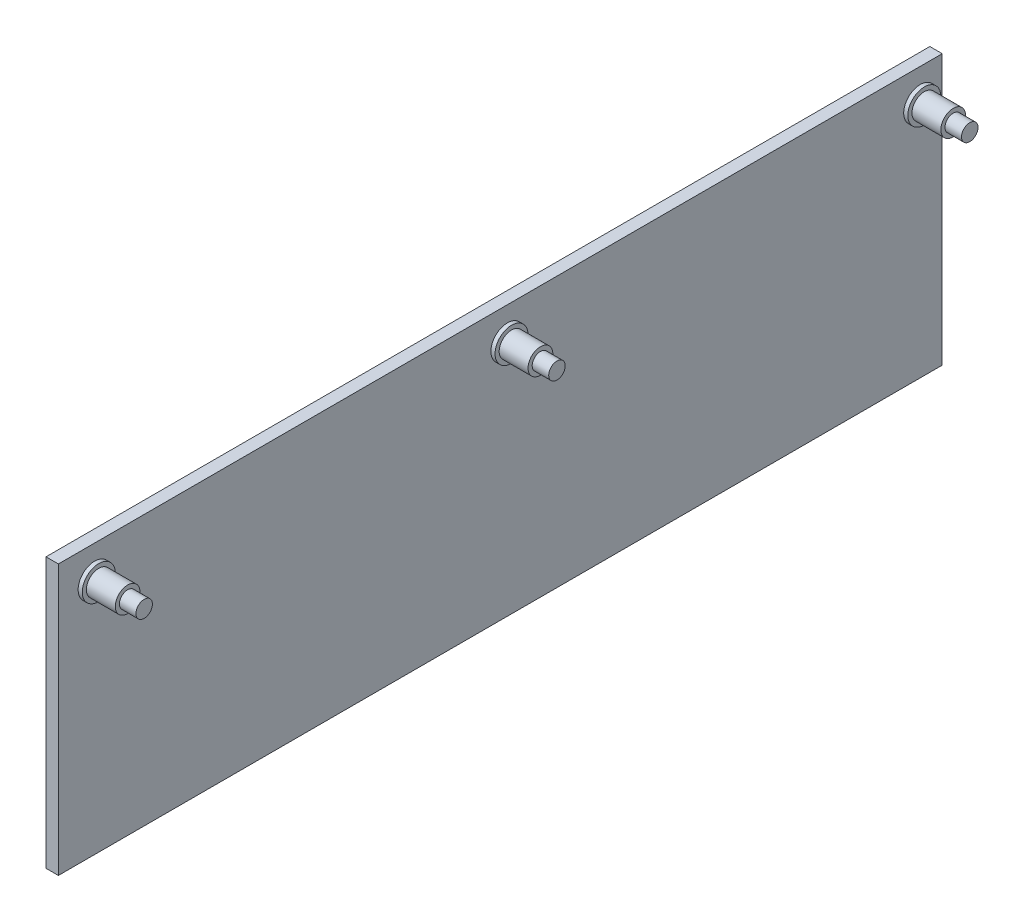
ISO-10303-21;
HEADER;
FILE_DESCRIPTION(('STEP AP214'),'2;1');
FILE_NAME('part.step','',(''),(''),'','','');
FILE_SCHEMA(('AUTOMOTIVE_DESIGN { 1 0 10303 214 1 1 1 1 }'));
ENDSEC;
DATA;
#1=APPLICATION_CONTEXT('core data for automotive mechanical design processes');
#2=APPLICATION_PROTOCOL_DEFINITION('international standard','automotive_design',2000,#1);
#3=PRODUCT_CONTEXT('',#1,'mechanical');
#4=PRODUCT('Part','Part','',(#3));
#5=PRODUCT_RELATED_PRODUCT_CATEGORY('part','',(#4));
#6=PRODUCT_DEFINITION_FORMATION('','',#4);
#7=PRODUCT_DEFINITION_CONTEXT('part definition',#1,'design');
#8=PRODUCT_DEFINITION('design','',#6,#7);
#9=PRODUCT_DEFINITION_SHAPE('','',#8);
#10=(LENGTH_UNIT() NAMED_UNIT(*) SI_UNIT(.MILLI.,.METRE.));
#11=(NAMED_UNIT(*) PLANE_ANGLE_UNIT() SI_UNIT($,.RADIAN.));
#12=(NAMED_UNIT(*) SI_UNIT($,.STERADIAN.) SOLID_ANGLE_UNIT());
#13=UNCERTAINTY_MEASURE_WITH_UNIT(LENGTH_MEASURE(1.E-05),#10,'distance_accuracy_value','');
#14=(GEOMETRIC_REPRESENTATION_CONTEXT(3) GLOBAL_UNCERTAINTY_ASSIGNED_CONTEXT((#13)) GLOBAL_UNIT_ASSIGNED_CONTEXT((#10,
#11,#12)) REPRESENTATION_CONTEXT('',''));
#15=CARTESIAN_POINT('',(0.,0.,0.));
#16=DIRECTION('',(0.,0.,1.));
#17=DIRECTION('',(1.,0.,0.));
#18=AXIS2_PLACEMENT_3D('',#15,#16,#17);
#19=CARTESIAN_POINT('',(11.,57.5544844238051,5.3347671097598));
#20=DIRECTION('',(-1.,0.,0.));
#21=DIRECTION('',(0.,0.,1.));
#22=AXIS2_PLACEMENT_3D('',#19,#20,#21);
#23=CYLINDRICAL_SURFACE('',#22,3.);
#24=CARTESIAN_POINT('',(4.,57.5544844238051,5.3347671097598));
#25=DIRECTION('',(1.,0.,0.));
#26=DIRECTION('',(0.,0.,-1.));
#27=AXIS2_PLACEMENT_3D('',#24,#25,#26);
#28=CIRCLE('',#27,3.);
#29=CARTESIAN_POINT('',(4.,57.5544844238051,2.3347671097598));
#30=VERTEX_POINT('',#29);
#31=EDGE_CURVE('E122',#30,#30,#28,.T.);
#32=ORIENTED_EDGE('',*,*,#31,.T.);
#33=EDGE_LOOP('',(#32));
#34=FACE_BOUND('',#33,.T.);
#35=CARTESIAN_POINT('',(11.,57.5544844238051,5.3347671097598));
#36=DIRECTION('',(1.,0.,0.));
#37=DIRECTION('',(0.,0.,-1.));
#38=AXIS2_PLACEMENT_3D('',#35,#36,#37);
#39=CIRCLE('',#38,3.);
#40=CARTESIAN_POINT('',(11.,57.5544844238051,2.3347671097598));
#41=VERTEX_POINT('',#40);
#42=EDGE_CURVE('E121',#41,#41,#39,.T.);
#43=ORIENTED_EDGE('',*,*,#42,.F.);
#44=EDGE_LOOP('',(#43));
#45=FACE_BOUND('',#44,.T.);
#46=ADVANCED_FACE('F41',(#34,#45),#23,.T.);
#47=CARTESIAN_POINT('',(11.,57.5544844238051,5.3347671097598));
#48=DIRECTION('',(1.,0.,0.));
#49=DIRECTION('',(0.,0.,-1.));
#50=AXIS2_PLACEMENT_3D('',#47,#48,#49);
#51=PLANE('',#50);
#52=CARTESIAN_POINT('',(11.,57.5544844238051,5.3347671097598));
#53=DIRECTION('',(1.,0.,0.));
#54=DIRECTION('',(0.,0.,-1.));
#55=AXIS2_PLACEMENT_3D('',#52,#53,#54);
#56=CIRCLE('',#55,2.);
#57=CARTESIAN_POINT('',(11.,57.5544844238051,3.3347671097598));
#58=VERTEX_POINT('',#57);
#59=EDGE_CURVE('E117',#58,#58,#56,.T.);
#60=ORIENTED_EDGE('',*,*,#59,.F.);
#61=EDGE_LOOP('',(#60));
#62=FACE_BOUND('',#61,.T.);
#63=ORIENTED_EDGE('',*,*,#42,.T.);
#64=EDGE_LOOP('',(#63));
#65=FACE_BOUND('',#64,.T.);
#66=ADVANCED_FACE('F184',(#62,#65),#51,.T.);
#67=CARTESIAN_POINT('',(15.,57.5544844238051,5.3347671097598));
#68=DIRECTION('',(1.,0.,0.));
#69=DIRECTION('',(0.,0.,-1.));
#70=AXIS2_PLACEMENT_3D('',#67,#68,#69);
#71=PLANE('',#70);
#72=CARTESIAN_POINT('',(15.,57.5544844238051,5.3347671097598));
#73=DIRECTION('',(1.,0.,0.));
#74=DIRECTION('',(0.,0.,-1.));
#75=AXIS2_PLACEMENT_3D('',#72,#73,#74);
#76=CIRCLE('',#75,2.);
#77=CARTESIAN_POINT('',(15.,57.5544844238051,3.3347671097598));
#78=VERTEX_POINT('',#77);
#79=EDGE_CURVE('E111',#78,#78,#76,.T.);
#80=ORIENTED_EDGE('',*,*,#79,.T.);
#81=EDGE_LOOP('',(#80));
#82=FACE_BOUND('',#81,.T.);
#83=ADVANCED_FACE('F168',(#82),#71,.T.);
#84=CARTESIAN_POINT('',(15.,57.5544844238051,5.3347671097598));
#85=DIRECTION('',(-1.,0.,0.));
#86=DIRECTION('',(0.,0.,1.));
#87=AXIS2_PLACEMENT_3D('',#84,#85,#86);
#88=CYLINDRICAL_SURFACE('',#87,2.);
#89=ORIENTED_EDGE('',*,*,#59,.T.);
#90=EDGE_LOOP('',(#89));
#91=FACE_BOUND('',#90,.T.);
#92=ORIENTED_EDGE('',*,*,#79,.F.);
#93=EDGE_LOOP('',(#92));
#94=FACE_BOUND('',#93,.T.);
#95=ADVANCED_FACE('F170',(#91,#94),#88,.T.);
#96=CARTESIAN_POINT('',(4.,57.5544844238051,5.3347671097598));
#97=DIRECTION('',(-1.,0.,0.));
#98=DIRECTION('',(0.,0.,1.));
#99=AXIS2_PLACEMENT_3D('',#96,#97,#98);
#100=CYLINDRICAL_SURFACE('',#99,4.);
#101=CARTESIAN_POINT('',(4.,57.5544844238051,5.3347671097598));
#102=DIRECTION('',(1.,0.,0.));
#103=DIRECTION('',(0.,0.,-1.));
#104=AXIS2_PLACEMENT_3D('',#101,#102,#103);
#105=CIRCLE('',#104,4.);
#106=CARTESIAN_POINT('',(4.,57.5544844238051,1.3347671097598));
#107=VERTEX_POINT('',#106);
#108=EDGE_CURVE('E125',#107,#107,#105,.T.);
#109=ORIENTED_EDGE('',*,*,#108,.F.);
#110=EDGE_LOOP('',(#109));
#111=FACE_BOUND('',#110,.T.);
#112=CARTESIAN_POINT('',(3.,57.5544844238051,5.3347671097598));
#113=DIRECTION('',(1.,0.,0.));
#114=DIRECTION('',(0.,0.,-1.));
#115=AXIS2_PLACEMENT_3D('',#112,#113,#114);
#116=CIRCLE('',#115,4.);
#117=CARTESIAN_POINT('',(3.,57.5544844238051,1.3347671097598));
#118=VERTEX_POINT('',#117);
#119=EDGE_CURVE('E129',#118,#118,#116,.T.);
#120=ORIENTED_EDGE('',*,*,#119,.T.);
#121=EDGE_LOOP('',(#120));
#122=FACE_BOUND('',#121,.T.);
#123=ADVANCED_FACE('F172',(#111,#122),#100,.T.);
#124=CARTESIAN_POINT('',(4.,57.5544844238051,5.3347671097598));
#125=DIRECTION('',(1.,0.,0.));
#126=DIRECTION('',(0.,0.,-1.));
#127=AXIS2_PLACEMENT_3D('',#124,#125,#126);
#128=PLANE('',#127);
#129=ORIENTED_EDGE('',*,*,#31,.F.);
#130=EDGE_LOOP('',(#129));
#131=FACE_BOUND('',#130,.T.);
#132=ORIENTED_EDGE('',*,*,#108,.T.);
#133=EDGE_LOOP('',(#132));
#134=FACE_BOUND('',#133,.T.);
#135=ADVANCED_FACE('F180',(#131,#134),#128,.T.);
#136=CARTESIAN_POINT('',(0.,0.,0.));
#137=DIRECTION('',(1.,0.,0.));
#138=DIRECTION('',(0.,0.,-1.));
#139=AXIS2_PLACEMENT_3D('',#136,#137,#138);
#140=PLANE('',#139);
#141=DIRECTION('',(0.,0.,-1.));
#142=VECTOR('',#141,1.);
#143=CARTESIAN_POINT('',(0.,0.,214.117990109261));
#144=LINE('',#143,#142);
#145=CARTESIAN_POINT('',(0.,0.,214.117990109261));
#146=VERTEX_POINT('',#145);
#147=CARTESIAN_POINT('',(0.,0.,0.));
#148=VERTEX_POINT('',#147);
#149=EDGE_CURVE('E108',#146,#148,#144,.T.);
#150=ORIENTED_EDGE('',*,*,#149,.F.);
#151=DIRECTION('',(0.,-1.,0.));
#152=VECTOR('',#151,1.);
#153=CARTESIAN_POINT('',(0.,65.3592410456608,214.117990109261));
#154=LINE('',#153,#152);
#155=CARTESIAN_POINT('',(0.,65.3592410456608,214.117990109261));
#156=VERTEX_POINT('',#155);
#157=EDGE_CURVE('E83',#156,#146,#154,.T.);
#158=ORIENTED_EDGE('',*,*,#157,.F.);
#159=DIRECTION('',(0.,0.,1.));
#160=VECTOR('',#159,1.);
#161=CARTESIAN_POINT('',(0.,65.3592410456608,0.));
#162=LINE('',#161,#160);
#163=CARTESIAN_POINT('',(0.,65.3592410456608,0.));
#164=VERTEX_POINT('',#163);
#165=EDGE_CURVE('E77',#164,#156,#162,.T.);
#166=ORIENTED_EDGE('',*,*,#165,.F.);
#167=DIRECTION('',(0.,1.,0.));
#168=VECTOR('',#167,1.);
#169=CARTESIAN_POINT('',(0.,0.,0.));
#170=LINE('',#169,#168);
#171=EDGE_CURVE('E99',#148,#164,#170,.T.);
#172=ORIENTED_EDGE('',*,*,#171,.F.);
#173=EDGE_LOOP('',(#150,#158,#166,#172));
#174=FACE_BOUND('',#173,.T.);
#175=ADVANCED_FACE('F240',(#174),#140,.F.);
#176=CARTESIAN_POINT('',(3.,65.3592410456608,214.117990109261));
#177=DIRECTION('',(0.,0.,-1.));
#178=DIRECTION('',(-1.,0.,0.));
#179=AXIS2_PLACEMENT_3D('',#176,#177,#178);
#180=PLANE('',#179);
#181=ORIENTED_EDGE('',*,*,#157,.T.);
#182=DIRECTION('',(-1.,0.,0.));
#183=VECTOR('',#182,1.);
#184=CARTESIAN_POINT('',(3.,0.,214.117990109261));
#185=LINE('',#184,#183);
#186=CARTESIAN_POINT('',(3.,0.,214.117990109261));
#187=VERTEX_POINT('',#186);
#188=EDGE_CURVE('E104',#187,#146,#185,.T.);
#189=ORIENTED_EDGE('',*,*,#188,.F.);
#190=DIRECTION('',(0.,-1.,0.));
#191=VECTOR('',#190,1.);
#192=CARTESIAN_POINT('',(3.,65.3592410456608,214.117990109261));
#193=LINE('',#192,#191);
#194=CARTESIAN_POINT('',(3.,65.3592410456608,214.117990109261));
#195=VERTEX_POINT('',#194);
#196=EDGE_CURVE('E60',#195,#187,#193,.T.);
#197=ORIENTED_EDGE('',*,*,#196,.F.);
#198=DIRECTION('',(-1.,0.,0.));
#199=VECTOR('',#198,1.);
#200=CARTESIAN_POINT('',(3.,65.3592410456608,214.117990109261));
#201=LINE('',#200,#199);
#202=EDGE_CURVE('E100',#195,#156,#201,.T.);
#203=ORIENTED_EDGE('',*,*,#202,.T.);
#204=EDGE_LOOP('',(#181,#189,#197,#203));
#205=FACE_BOUND('',#204,.T.);
#206=ADVANCED_FACE('F245',(#205),#180,.F.);
#207=CARTESIAN_POINT('',(3.,65.3592410456608,0.));
#208=DIRECTION('',(0.,-1.,0.));
#209=DIRECTION('',(0.,0.,-1.));
#210=AXIS2_PLACEMENT_3D('',#207,#208,#209);
#211=PLANE('',#210);
#212=ORIENTED_EDGE('',*,*,#165,.T.);
#213=ORIENTED_EDGE('',*,*,#202,.F.);
#214=DIRECTION('',(0.,0.,1.));
#215=VECTOR('',#214,1.);
#216=CARTESIAN_POINT('',(3.,65.3592410456608,0.));
#217=LINE('',#216,#215);
#218=CARTESIAN_POINT('',(3.,65.3592410456608,0.));
#219=VERTEX_POINT('',#218);
#220=EDGE_CURVE('E93',#219,#195,#217,.T.);
#221=ORIENTED_EDGE('',*,*,#220,.F.);
#222=DIRECTION('',(-1.,0.,0.));
#223=VECTOR('',#222,1.);
#224=CARTESIAN_POINT('',(3.,65.3592410456608,0.));
#225=LINE('',#224,#223);
#226=EDGE_CURVE('E51',#219,#164,#225,.T.);
#227=ORIENTED_EDGE('',*,*,#226,.T.);
#228=EDGE_LOOP('',(#212,#213,#221,#227));
#229=FACE_BOUND('',#228,.T.);
#230=ADVANCED_FACE('F102',(#229),#211,.F.);
#231=CARTESIAN_POINT('',(3.,0.,0.));
#232=DIRECTION('',(0.,0.,1.));
#233=DIRECTION('',(1.,0.,0.));
#234=AXIS2_PLACEMENT_3D('',#231,#232,#233);
#235=PLANE('',#234);
#236=ORIENTED_EDGE('',*,*,#171,.T.);
#237=ORIENTED_EDGE('',*,*,#226,.F.);
#238=DIRECTION('',(0.,1.,0.));
#239=VECTOR('',#238,1.);
#240=CARTESIAN_POINT('',(3.,0.,0.));
#241=LINE('',#240,#239);
#242=CARTESIAN_POINT('',(3.,0.,0.));
#243=VERTEX_POINT('',#242);
#244=EDGE_CURVE('E90',#243,#219,#241,.T.);
#245=ORIENTED_EDGE('',*,*,#244,.F.);
#246=DIRECTION('',(-1.,0.,0.));
#247=VECTOR('',#246,1.);
#248=CARTESIAN_POINT('',(3.,0.,0.));
#249=LINE('',#248,#247);
#250=EDGE_CURVE('E11',#243,#148,#249,.T.);
#251=ORIENTED_EDGE('',*,*,#250,.T.);
#252=EDGE_LOOP('',(#236,#237,#245,#251));
#253=FACE_BOUND('',#252,.T.);
#254=ADVANCED_FACE('F98',(#253),#235,.F.);
#255=CARTESIAN_POINT('',(3.,0.,214.117990109261));
#256=DIRECTION('',(0.,1.,0.));
#257=DIRECTION('',(0.,0.,1.));
#258=AXIS2_PLACEMENT_3D('',#255,#256,#257);
#259=PLANE('',#258);
#260=ORIENTED_EDGE('',*,*,#149,.T.);
#261=ORIENTED_EDGE('',*,*,#250,.F.);
#262=DIRECTION('',(0.,0.,-1.));
#263=VECTOR('',#262,1.);
#264=CARTESIAN_POINT('',(3.,0.,214.117990109261));
#265=LINE('',#264,#263);
#266=EDGE_CURVE('E95',#187,#243,#265,.T.);
#267=ORIENTED_EDGE('',*,*,#266,.F.);
#268=ORIENTED_EDGE('',*,*,#188,.T.);
#269=EDGE_LOOP('',(#260,#261,#267,#268));
#270=FACE_BOUND('',#269,.T.);
#271=ADVANCED_FACE('F43',(#270),#259,.F.);
#272=CARTESIAN_POINT('',(3.,0.,0.));
#273=DIRECTION('',(1.,0.,0.));
#274=DIRECTION('',(0.,0.,-1.));
#275=AXIS2_PLACEMENT_3D('',#272,#273,#274);
#276=PLANE('',#275);
#277=CARTESIAN_POINT('',(3.,57.5544844238053,205.334767109757));
#278=DIRECTION('',(1.,0.,0.));
#279=DIRECTION('',(0.,0.,-1.));
#280=AXIS2_PLACEMENT_3D('',#277,#278,#279);
#281=CIRCLE('',#280,3.99999999999999);
#282=CARTESIAN_POINT('',(3.,57.5544844238053,201.334767109757));
#283=VERTEX_POINT('',#282);
#284=EDGE_CURVE('E149',#283,#283,#281,.T.);
#285=ORIENTED_EDGE('',*,*,#284,.F.);
#286=EDGE_LOOP('',(#285));
#287=FACE_BOUND('',#286,.T.);
#288=CARTESIAN_POINT('',(3.,57.554484423805,105.33476710976));
#289=DIRECTION('',(1.,0.,0.));
#290=DIRECTION('',(0.,0.,-1.));
#291=AXIS2_PLACEMENT_3D('',#288,#289,#290);
#292=CIRCLE('',#291,4.00000000000281);
#293=CARTESIAN_POINT('',(3.,57.554484423805,101.334767109757));
#294=VERTEX_POINT('',#293);
#295=EDGE_CURVE('E142',#294,#294,#292,.T.);
#296=ORIENTED_EDGE('',*,*,#295,.F.);
#297=EDGE_LOOP('',(#296));
#298=FACE_BOUND('',#297,.T.);
#299=ORIENTED_EDGE('',*,*,#119,.F.);
#300=EDGE_LOOP('',(#299));
#301=FACE_BOUND('',#300,.T.);
#302=ORIENTED_EDGE('',*,*,#266,.T.);
#303=ORIENTED_EDGE('',*,*,#244,.T.);
#304=ORIENTED_EDGE('',*,*,#220,.T.);
#305=ORIENTED_EDGE('',*,*,#196,.T.);
#306=EDGE_LOOP('',(#302,#303,#304,#305));
#307=FACE_BOUND('',#306,.T.);
#308=ADVANCED_FACE('F91',(#287,#298,#301,#307),#276,.T.);
#309=CARTESIAN_POINT('',(4.,57.554484423805,105.33476710976));
#310=DIRECTION('',(-1.,0.,0.));
#311=DIRECTION('',(0.,0.,1.));
#312=AXIS2_PLACEMENT_3D('',#309,#310,#311);
#313=CYLINDRICAL_SURFACE('',#312,4.00000000000281);
#314=CARTESIAN_POINT('',(4.,57.554484423805,105.33476710976));
#315=DIRECTION('',(1.,0.,0.));
#316=DIRECTION('',(0.,0.,-1.));
#317=AXIS2_PLACEMENT_3D('',#314,#315,#316);
#318=CIRCLE('',#317,4.00000000000281);
#319=CARTESIAN_POINT('',(4.,57.554484423805,101.334767109757));
#320=VERTEX_POINT('',#319);
#321=EDGE_CURVE('E136',#320,#320,#318,.T.);
#322=ORIENTED_EDGE('',*,*,#321,.F.);
#323=EDGE_LOOP('',(#322));
#324=FACE_BOUND('',#323,.T.);
#325=ORIENTED_EDGE('',*,*,#295,.T.);
#326=EDGE_LOOP('',(#325));
#327=FACE_BOUND('',#326,.T.);
#328=ADVANCED_FACE('F254',(#324,#327),#313,.T.);
#329=CARTESIAN_POINT('',(4.,57.554484423805,105.33476710976));
#330=DIRECTION('',(1.,0.,0.));
#331=DIRECTION('',(0.,0.,-1.));
#332=AXIS2_PLACEMENT_3D('',#329,#330,#331);
#333=PLANE('',#332);
#334=CARTESIAN_POINT('',(4.,57.554484423805,105.33476710976));
#335=DIRECTION('',(1.,0.,0.));
#336=DIRECTION('',(0.,0.,-1.));
#337=AXIS2_PLACEMENT_3D('',#334,#335,#336);
#338=CIRCLE('',#337,3.00000000000282);
#339=CARTESIAN_POINT('',(4.,57.554484423805,102.334767109757));
#340=VERTEX_POINT('',#339);
#341=EDGE_CURVE('E134',#340,#340,#338,.T.);
#342=ORIENTED_EDGE('',*,*,#341,.F.);
#343=EDGE_LOOP('',(#342));
#344=FACE_BOUND('',#343,.T.);
#345=ORIENTED_EDGE('',*,*,#321,.T.);
#346=EDGE_LOOP('',(#345));
#347=FACE_BOUND('',#346,.T.);
#348=ADVANCED_FACE('F209',(#344,#347),#333,.T.);
#349=CARTESIAN_POINT('',(15.,57.554484423805,105.33476710976));
#350=DIRECTION('',(1.,0.,0.));
#351=DIRECTION('',(0.,0.,-1.));
#352=AXIS2_PLACEMENT_3D('',#349,#350,#351);
#353=PLANE('',#352);
#354=CARTESIAN_POINT('',(15.,57.554484423805,105.33476710976));
#355=DIRECTION('',(1.,0.,0.));
#356=DIRECTION('',(0.,0.,-1.));
#357=AXIS2_PLACEMENT_3D('',#354,#355,#356);
#358=CIRCLE('',#357,2.0000000000028);
#359=CARTESIAN_POINT('',(15.,57.554484423805,103.334767109757));
#360=VERTEX_POINT('',#359);
#361=EDGE_CURVE('E162',#360,#360,#358,.T.);
#362=ORIENTED_EDGE('',*,*,#361,.T.);
#363=EDGE_LOOP('',(#362));
#364=FACE_BOUND('',#363,.T.);
#365=ADVANCED_FACE('F205',(#364),#353,.T.);
#366=CARTESIAN_POINT('',(15.,57.554484423805,105.33476710976));
#367=DIRECTION('',(-1.,0.,0.));
#368=DIRECTION('',(0.,0.,1.));
#369=AXIS2_PLACEMENT_3D('',#366,#367,#368);
#370=CYLINDRICAL_SURFACE('',#369,2.0000000000028);
#371=CARTESIAN_POINT('',(11.,57.554484423805,105.33476710976));
#372=DIRECTION('',(1.,0.,0.));
#373=DIRECTION('',(0.,0.,-1.));
#374=AXIS2_PLACEMENT_3D('',#371,#372,#373);
#375=CIRCLE('',#374,2.0000000000028);
#376=CARTESIAN_POINT('',(11.,57.554484423805,103.334767109757));
#377=VERTEX_POINT('',#376);
#378=EDGE_CURVE('E126',#377,#377,#375,.T.);
#379=ORIENTED_EDGE('',*,*,#378,.T.);
#380=EDGE_LOOP('',(#379));
#381=FACE_BOUND('',#380,.T.);
#382=ORIENTED_EDGE('',*,*,#361,.F.);
#383=EDGE_LOOP('',(#382));
#384=FACE_BOUND('',#383,.T.);
#385=ADVANCED_FACE('F208',(#381,#384),#370,.T.);
#386=CARTESIAN_POINT('',(11.,57.554484423805,105.33476710976));
#387=DIRECTION('',(1.,0.,0.));
#388=DIRECTION('',(0.,0.,-1.));
#389=AXIS2_PLACEMENT_3D('',#386,#387,#388);
#390=PLANE('',#389);
#391=ORIENTED_EDGE('',*,*,#378,.F.);
#392=EDGE_LOOP('',(#391));
#393=FACE_BOUND('',#392,.T.);
#394=CARTESIAN_POINT('',(11.,57.554484423805,105.33476710976));
#395=DIRECTION('',(1.,0.,0.));
#396=DIRECTION('',(0.,0.,-1.));
#397=AXIS2_PLACEMENT_3D('',#394,#395,#396);
#398=CIRCLE('',#397,3.00000000000282);
#399=CARTESIAN_POINT('',(11.,57.554484423805,102.334767109757));
#400=VERTEX_POINT('',#399);
#401=EDGE_CURVE('E130',#400,#400,#398,.T.);
#402=ORIENTED_EDGE('',*,*,#401,.T.);
#403=EDGE_LOOP('',(#402));
#404=FACE_BOUND('',#403,.T.);
#405=ADVANCED_FACE('F212',(#393,#404),#390,.T.);
#406=CARTESIAN_POINT('',(11.,57.554484423805,105.33476710976));
#407=DIRECTION('',(-1.,0.,0.));
#408=DIRECTION('',(0.,0.,1.));
#409=AXIS2_PLACEMENT_3D('',#406,#407,#408);
#410=CYLINDRICAL_SURFACE('',#409,3.00000000000282);
#411=ORIENTED_EDGE('',*,*,#341,.T.);
#412=EDGE_LOOP('',(#411));
#413=FACE_BOUND('',#412,.T.);
#414=ORIENTED_EDGE('',*,*,#401,.F.);
#415=EDGE_LOOP('',(#414));
#416=FACE_BOUND('',#415,.T.);
#417=ADVANCED_FACE('F218',(#413,#416),#410,.T.);
#418=CARTESIAN_POINT('',(4.,57.5544844238053,205.334767109757));
#419=DIRECTION('',(-1.,0.,0.));
#420=DIRECTION('',(0.,0.,1.));
#421=AXIS2_PLACEMENT_3D('',#418,#419,#420);
#422=CYLINDRICAL_SURFACE('',#421,3.99999999999999);
#423=CARTESIAN_POINT('',(4.,57.5544844238053,205.334767109757));
#424=DIRECTION('',(1.,0.,0.));
#425=DIRECTION('',(0.,0.,-1.));
#426=AXIS2_PLACEMENT_3D('',#423,#424,#425);
#427=CIRCLE('',#426,3.99999999999999);
#428=CARTESIAN_POINT('',(4.,57.5544844238053,201.334767109757));
#429=VERTEX_POINT('',#428);
#430=EDGE_CURVE('E388',#429,#429,#427,.T.);
#431=ORIENTED_EDGE('',*,*,#430,.F.);
#432=EDGE_LOOP('',(#431));
#433=FACE_BOUND('',#432,.T.);
#434=ORIENTED_EDGE('',*,*,#284,.T.);
#435=EDGE_LOOP('',(#434));
#436=FACE_BOUND('',#435,.T.);
#437=ADVANCED_FACE('F228',(#433,#436),#422,.T.);
#438=CARTESIAN_POINT('',(4.,57.5544844238053,205.334767109757));
#439=DIRECTION('',(1.,0.,0.));
#440=DIRECTION('',(0.,0.,-1.));
#441=AXIS2_PLACEMENT_3D('',#438,#439,#440);
#442=PLANE('',#441);
#443=CARTESIAN_POINT('',(4.,57.5544844238053,205.334767109757));
#444=DIRECTION('',(1.,0.,0.));
#445=DIRECTION('',(0.,0.,-1.));
#446=AXIS2_PLACEMENT_3D('',#443,#444,#445);
#447=CIRCLE('',#446,2.99999999999999);
#448=CARTESIAN_POINT('',(4.,57.5544844238053,202.334767109757));
#449=VERTEX_POINT('',#448);
#450=EDGE_CURVE('E45',#449,#449,#447,.T.);
#451=ORIENTED_EDGE('',*,*,#450,.F.);
#452=EDGE_LOOP('',(#451));
#453=FACE_BOUND('',#452,.T.);
#454=ORIENTED_EDGE('',*,*,#430,.T.);
#455=EDGE_LOOP('',(#454));
#456=FACE_BOUND('',#455,.T.);
#457=ADVANCED_FACE('F199',(#453,#456),#442,.T.);
#458=CARTESIAN_POINT('',(15.,57.5544844238053,205.334767109757));
#459=DIRECTION('',(1.,0.,0.));
#460=DIRECTION('',(0.,0.,-1.));
#461=AXIS2_PLACEMENT_3D('',#458,#459,#460);
#462=PLANE('',#461);
#463=CARTESIAN_POINT('',(15.,57.5544844238053,205.334767109757));
#464=DIRECTION('',(1.,0.,0.));
#465=DIRECTION('',(0.,0.,-1.));
#466=AXIS2_PLACEMENT_3D('',#463,#464,#465);
#467=CIRCLE('',#466,2.);
#468=CARTESIAN_POINT('',(15.,57.5544844238053,203.334767109757));
#469=VERTEX_POINT('',#468);
#470=EDGE_CURVE('E120',#469,#469,#467,.T.);
#471=ORIENTED_EDGE('',*,*,#470,.T.);
#472=EDGE_LOOP('',(#471));
#473=FACE_BOUND('',#472,.T.);
#474=ADVANCED_FACE('F195',(#473),#462,.T.);
#475=CARTESIAN_POINT('',(15.,57.5544844238053,205.334767109757));
#476=DIRECTION('',(-1.,0.,0.));
#477=DIRECTION('',(0.,0.,1.));
#478=AXIS2_PLACEMENT_3D('',#475,#476,#477);
#479=CYLINDRICAL_SURFACE('',#478,2.);
#480=CARTESIAN_POINT('',(11.,57.5544844238053,205.334767109757));
#481=DIRECTION('',(1.,0.,0.));
#482=DIRECTION('',(0.,0.,-1.));
#483=AXIS2_PLACEMENT_3D('',#480,#481,#482);
#484=CIRCLE('',#483,2.);
#485=CARTESIAN_POINT('',(11.,57.5544844238053,203.334767109757));
#486=VERTEX_POINT('',#485);
#487=EDGE_CURVE('E131',#486,#486,#484,.T.);
#488=ORIENTED_EDGE('',*,*,#487,.T.);
#489=EDGE_LOOP('',(#488));
#490=FACE_BOUND('',#489,.T.);
#491=ORIENTED_EDGE('',*,*,#470,.F.);
#492=EDGE_LOOP('',(#491));
#493=FACE_BOUND('',#492,.T.);
#494=ADVANCED_FACE('F198',(#490,#493),#479,.T.);
#495=CARTESIAN_POINT('',(11.,57.5544844238053,205.334767109757));
#496=DIRECTION('',(1.,0.,0.));
#497=DIRECTION('',(0.,0.,-1.));
#498=AXIS2_PLACEMENT_3D('',#495,#496,#497);
#499=PLANE('',#498);
#500=ORIENTED_EDGE('',*,*,#487,.F.);
#501=EDGE_LOOP('',(#500));
#502=FACE_BOUND('',#501,.T.);
#503=CARTESIAN_POINT('',(11.,57.5544844238053,205.334767109757));
#504=DIRECTION('',(1.,0.,0.));
#505=DIRECTION('',(0.,0.,-1.));
#506=AXIS2_PLACEMENT_3D('',#503,#504,#505);
#507=CIRCLE('',#506,2.99999999999999);
#508=CARTESIAN_POINT('',(11.,57.5544844238053,202.334767109757));
#509=VERTEX_POINT('',#508);
#510=EDGE_CURVE('E133',#509,#509,#507,.T.);
#511=ORIENTED_EDGE('',*,*,#510,.T.);
#512=EDGE_LOOP('',(#511));
#513=FACE_BOUND('',#512,.T.);
#514=ADVANCED_FACE('F203',(#502,#513),#499,.T.);
#515=CARTESIAN_POINT('',(11.,57.5544844238053,205.334767109757));
#516=DIRECTION('',(-1.,0.,0.));
#517=DIRECTION('',(0.,0.,1.));
#518=AXIS2_PLACEMENT_3D('',#515,#516,#517);
#519=CYLINDRICAL_SURFACE('',#518,2.99999999999999);
#520=ORIENTED_EDGE('',*,*,#450,.T.);
#521=EDGE_LOOP('',(#520));
#522=FACE_BOUND('',#521,.T.);
#523=ORIENTED_EDGE('',*,*,#510,.F.);
#524=EDGE_LOOP('',(#523));
#525=FACE_BOUND('',#524,.T.);
#526=ADVANCED_FACE('F339',(#522,#525),#519,.T.);
#527=CLOSED_SHELL('',(#46,#66,#83,#95,#123,#135,#175,#206,#230,#254,#271,#308,#328,#348,#365,
#385,#405,#417,#437,#457,#474,#494,#514,#526));
#528=MANIFOLD_SOLID_BREP('B2',#527);
#529=ADVANCED_BREP_SHAPE_REPRESENTATION('',(#18,#528),#14);
#530=SHAPE_DEFINITION_REPRESENTATION(#9,#529);
ENDSEC;
END-ISO-10303-21;
